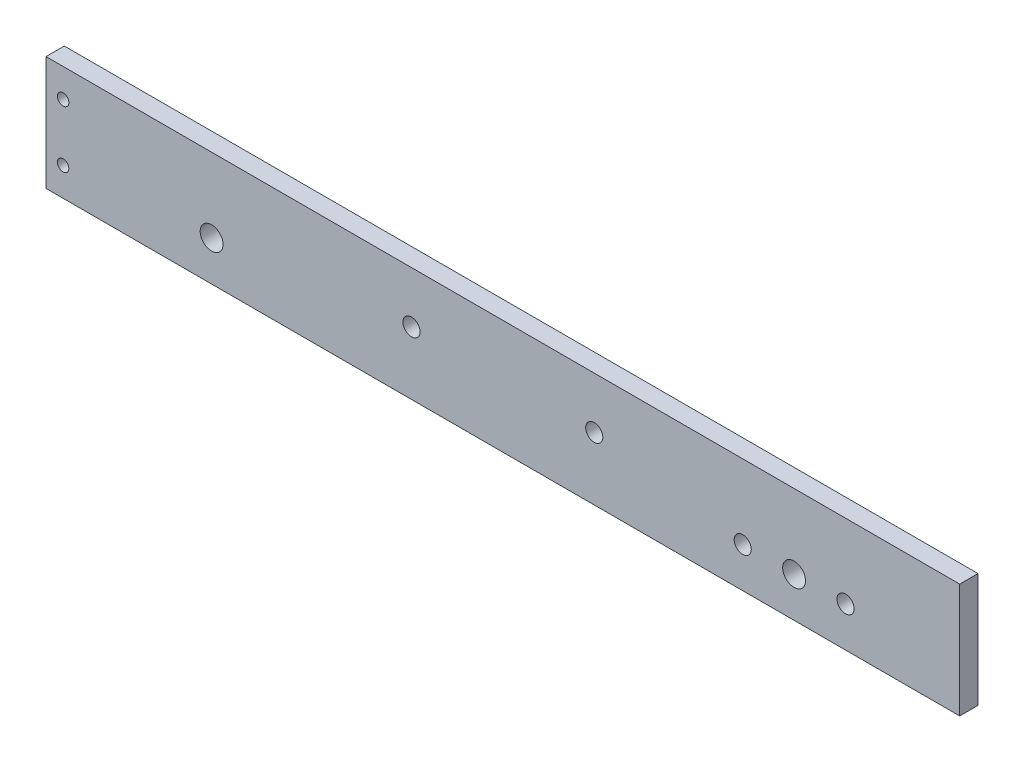
ISO-10303-21;
HEADER;
FILE_DESCRIPTION(('STEP AP214'),'2;1');
FILE_NAME('part.step','',(''),(''),'','','');
FILE_SCHEMA(('AUTOMOTIVE_DESIGN { 1 0 10303 214 1 1 1 1 }'));
ENDSEC;
DATA;
#1=APPLICATION_CONTEXT('core data for automotive mechanical design processes');
#2=APPLICATION_PROTOCOL_DEFINITION('international standard','automotive_design',2000,#1);
#3=PRODUCT_CONTEXT('',#1,'mechanical');
#4=PRODUCT('Part','Part','',(#3));
#5=PRODUCT_RELATED_PRODUCT_CATEGORY('part','',(#4));
#6=PRODUCT_DEFINITION_FORMATION('','',#4);
#7=PRODUCT_DEFINITION_CONTEXT('part definition',#1,'design');
#8=PRODUCT_DEFINITION('design','',#6,#7);
#9=PRODUCT_DEFINITION_SHAPE('','',#8);
#10=(LENGTH_UNIT() NAMED_UNIT(*) SI_UNIT(.MILLI.,.METRE.));
#11=(NAMED_UNIT(*) PLANE_ANGLE_UNIT() SI_UNIT($,.RADIAN.));
#12=(NAMED_UNIT(*) SI_UNIT($,.STERADIAN.) SOLID_ANGLE_UNIT());
#13=UNCERTAINTY_MEASURE_WITH_UNIT(LENGTH_MEASURE(1.E-05),#10,'distance_accuracy_value','');
#14=(GEOMETRIC_REPRESENTATION_CONTEXT(3) GLOBAL_UNCERTAINTY_ASSIGNED_CONTEXT((#13)) GLOBAL_UNIT_ASSIGNED_CONTEXT((#10,
#11,#12)) REPRESENTATION_CONTEXT('',''));
#15=CARTESIAN_POINT('',(0.,0.,0.));
#16=DIRECTION('',(0.,0.,1.));
#17=DIRECTION('',(1.,0.,0.));
#18=AXIS2_PLACEMENT_3D('',#15,#16,#17);
#19=CARTESIAN_POINT('',(0.,0.,6.8));
#20=DIRECTION('',(1.,0.,0.));
#21=DIRECTION('',(0.,0.,-1.));
#22=AXIS2_PLACEMENT_3D('',#19,#20,#21);
#23=PLANE('',#22);
#24=DIRECTION('',(0.,1.,0.));
#25=VECTOR('',#24,1.);
#26=CARTESIAN_POINT('',(0.,0.,10.));
#27=LINE('',#26,#25);
#28=CARTESIAN_POINT('',(0.,-20.,10.));
#29=VERTEX_POINT('',#28);
#30=CARTESIAN_POINT('',(0.,0.,10.));
#31=VERTEX_POINT('',#30);
#32=EDGE_CURVE('E103',#29,#31,#27,.T.);
#33=ORIENTED_EDGE('',*,*,#32,.T.);
#34=DIRECTION('',(0.,0.,1.));
#35=VECTOR('',#34,1.);
#36=CARTESIAN_POINT('',(0.,0.,6.8));
#37=LINE('',#36,#35);
#38=CARTESIAN_POINT('',(0.,0.,6.8));
#39=VERTEX_POINT('',#38);
#40=EDGE_CURVE('E11',#39,#31,#37,.T.);
#41=ORIENTED_EDGE('',*,*,#40,.F.);
#42=DIRECTION('',(0.,1.,0.));
#43=VECTOR('',#42,1.);
#44=CARTESIAN_POINT('',(0.,0.,6.8));
#45=LINE('',#44,#43);
#46=CARTESIAN_POINT('',(0.,-20.,6.8));
#47=VERTEX_POINT('',#46);
#48=EDGE_CURVE('E90',#47,#39,#45,.T.);
#49=ORIENTED_EDGE('',*,*,#48,.F.);
#50=DIRECTION('',(0.,0.,1.));
#51=VECTOR('',#50,1.);
#52=CARTESIAN_POINT('',(0.,-20.,6.8));
#53=LINE('',#52,#51);
#54=EDGE_CURVE('E99',#47,#29,#53,.T.);
#55=ORIENTED_EDGE('',*,*,#54,.T.);
#56=EDGE_LOOP('',(#33,#41,#49,#55));
#57=FACE_BOUND('',#56,.T.);
#58=ADVANCED_FACE('F37',(#57),#23,.F.);
#59=CARTESIAN_POINT('',(0.,0.,6.8));
#60=DIRECTION('',(0.,-1.,0.));
#61=DIRECTION('',(0.,0.,-1.));
#62=AXIS2_PLACEMENT_3D('',#59,#60,#61);
#63=PLANE('',#62);
#64=DIRECTION('',(1.,0.,0.));
#65=VECTOR('',#64,1.);
#66=CARTESIAN_POINT('',(0.,0.,10.));
#67=LINE('',#66,#65);
#68=CARTESIAN_POINT('',(160.,0.,10.));
#69=VERTEX_POINT('',#68);
#70=EDGE_CURVE('E94',#31,#69,#67,.T.);
#71=ORIENTED_EDGE('',*,*,#70,.T.);
#72=DIRECTION('',(0.,0.,1.));
#73=VECTOR('',#72,1.);
#74=CARTESIAN_POINT('',(160.,0.,6.8));
#75=LINE('',#74,#73);
#76=CARTESIAN_POINT('',(160.,0.,6.8));
#77=VERTEX_POINT('',#76);
#78=EDGE_CURVE('E46',#77,#69,#75,.T.);
#79=ORIENTED_EDGE('',*,*,#78,.F.);
#80=DIRECTION('',(1.,0.,0.));
#81=VECTOR('',#80,1.);
#82=CARTESIAN_POINT('',(0.,0.,6.8));
#83=LINE('',#82,#81);
#84=EDGE_CURVE('E85',#39,#77,#83,.T.);
#85=ORIENTED_EDGE('',*,*,#84,.F.);
#86=ORIENTED_EDGE('',*,*,#40,.T.);
#87=EDGE_LOOP('',(#71,#79,#85,#86));
#88=FACE_BOUND('',#87,.T.);
#89=ADVANCED_FACE('F93',(#88),#63,.F.);
#90=CARTESIAN_POINT('',(160.,0.,6.8));
#91=DIRECTION('',(-1.,0.,0.));
#92=DIRECTION('',(0.,0.,1.));
#93=AXIS2_PLACEMENT_3D('',#90,#91,#92);
#94=PLANE('',#93);
#95=DIRECTION('',(0.,-1.,0.));
#96=VECTOR('',#95,1.);
#97=CARTESIAN_POINT('',(160.,0.,10.));
#98=LINE('',#97,#96);
#99=CARTESIAN_POINT('',(160.,-20.,10.));
#100=VERTEX_POINT('',#99);
#101=EDGE_CURVE('E72',#69,#100,#98,.T.);
#102=ORIENTED_EDGE('',*,*,#101,.T.);
#103=DIRECTION('',(0.,0.,1.));
#104=VECTOR('',#103,1.);
#105=CARTESIAN_POINT('',(160.,-20.,6.8));
#106=LINE('',#105,#104);
#107=CARTESIAN_POINT('',(160.,-20.,6.8));
#108=VERTEX_POINT('',#107);
#109=EDGE_CURVE('E95',#108,#100,#106,.T.);
#110=ORIENTED_EDGE('',*,*,#109,.F.);
#111=DIRECTION('',(0.,-1.,0.));
#112=VECTOR('',#111,1.);
#113=CARTESIAN_POINT('',(160.,0.,6.8));
#114=LINE('',#113,#112);
#115=EDGE_CURVE('E88',#77,#108,#114,.T.);
#116=ORIENTED_EDGE('',*,*,#115,.F.);
#117=ORIENTED_EDGE('',*,*,#78,.T.);
#118=EDGE_LOOP('',(#102,#110,#116,#117));
#119=FACE_BOUND('',#118,.T.);
#120=ADVANCED_FACE('F97',(#119),#94,.F.);
#121=CARTESIAN_POINT('',(0.,-20.,6.8));
#122=DIRECTION('',(0.,1.,0.));
#123=DIRECTION('',(0.,0.,1.));
#124=AXIS2_PLACEMENT_3D('',#121,#122,#123);
#125=PLANE('',#124);
#126=DIRECTION('',(-1.,0.,0.));
#127=VECTOR('',#126,1.);
#128=CARTESIAN_POINT('',(0.,-20.,10.));
#129=LINE('',#128,#127);
#130=EDGE_CURVE('E78',#100,#29,#129,.T.);
#131=ORIENTED_EDGE('',*,*,#130,.T.);
#132=ORIENTED_EDGE('',*,*,#54,.F.);
#133=DIRECTION('',(-1.,0.,0.));
#134=VECTOR('',#133,1.);
#135=CARTESIAN_POINT('',(0.,-20.,6.8));
#136=LINE('',#135,#134);
#137=EDGE_CURVE('E55',#108,#47,#136,.T.);
#138=ORIENTED_EDGE('',*,*,#137,.F.);
#139=ORIENTED_EDGE('',*,*,#109,.T.);
#140=EDGE_LOOP('',(#131,#132,#138,#139));
#141=FACE_BOUND('',#140,.T.);
#142=ADVANCED_FACE('F177',(#141),#125,.F.);
#143=CARTESIAN_POINT('',(0.,0.,6.8));
#144=DIRECTION('',(0.,0.,1.));
#145=DIRECTION('',(1.,0.,0.));
#146=AXIS2_PLACEMENT_3D('',#143,#144,#145);
#147=PLANE('',#146);
#148=CARTESIAN_POINT('',(140.,-13.,6.8));
#149=DIRECTION('',(0.,0.,1.));
#150=DIRECTION('',(1.,0.,0.));
#151=AXIS2_PLACEMENT_3D('',#148,#149,#150);
#152=CIRCLE('',#151,1.5);
#153=CARTESIAN_POINT('',(141.5,-13.,6.8));
#154=VERTEX_POINT('',#153);
#155=EDGE_CURVE('E130',#154,#154,#152,.T.);
#156=ORIENTED_EDGE('',*,*,#155,.T.);
#157=EDGE_LOOP('',(#156));
#158=FACE_BOUND('',#157,.T.);
#159=CARTESIAN_POINT('',(122.,-13.,6.8));
#160=DIRECTION('',(0.,0.,1.));
#161=DIRECTION('',(1.,0.,0.));
#162=AXIS2_PLACEMENT_3D('',#159,#160,#161);
#163=CIRCLE('',#162,1.50000000000001);
#164=CARTESIAN_POINT('',(123.5,-13.,6.8));
#165=VERTEX_POINT('',#164);
#166=EDGE_CURVE('E289',#165,#165,#163,.T.);
#167=ORIENTED_EDGE('',*,*,#166,.T.);
#168=EDGE_LOOP('',(#167));
#169=FACE_BOUND('',#168,.T.);
#170=CARTESIAN_POINT('',(2.99999999999999,-15.,6.8));
#171=DIRECTION('',(0.,0.,1.));
#172=DIRECTION('',(1.,0.,0.));
#173=AXIS2_PLACEMENT_3D('',#170,#171,#172);
#174=CIRCLE('',#173,1.);
#175=CARTESIAN_POINT('',(3.99999999999999,-15.,6.8));
#176=VERTEX_POINT('',#175);
#177=EDGE_CURVE('E119',#176,#176,#174,.T.);
#178=ORIENTED_EDGE('',*,*,#177,.T.);
#179=EDGE_LOOP('',(#178));
#180=FACE_BOUND('',#179,.T.);
#181=CARTESIAN_POINT('',(3.,-5.,6.8));
#182=DIRECTION('',(0.,0.,1.));
#183=DIRECTION('',(1.,0.,0.));
#184=AXIS2_PLACEMENT_3D('',#181,#182,#183);
#185=CIRCLE('',#184,1.);
#186=CARTESIAN_POINT('',(4.,-5.,6.8));
#187=VERTEX_POINT('',#186);
#188=EDGE_CURVE('E125',#187,#187,#185,.T.);
#189=ORIENTED_EDGE('',*,*,#188,.T.);
#190=EDGE_LOOP('',(#189));
#191=FACE_BOUND('',#190,.T.);
#192=CARTESIAN_POINT('',(63.9999999999999,-9.,6.8));
#193=DIRECTION('',(0.,0.,1.));
#194=DIRECTION('',(1.,0.,0.));
#195=AXIS2_PLACEMENT_3D('',#192,#193,#194);
#196=CIRCLE('',#195,1.5);
#197=CARTESIAN_POINT('',(65.4999999999999,-9.,6.8));
#198=VERTEX_POINT('',#197);
#199=EDGE_CURVE('E143',#198,#198,#196,.T.);
#200=ORIENTED_EDGE('',*,*,#199,.T.);
#201=EDGE_LOOP('',(#200));
#202=FACE_BOUND('',#201,.T.);
#203=CARTESIAN_POINT('',(95.9999999999999,-9.,6.8));
#204=DIRECTION('',(0.,0.,1.));
#205=DIRECTION('',(1.,0.,0.));
#206=AXIS2_PLACEMENT_3D('',#203,#204,#205);
#207=CIRCLE('',#206,1.5);
#208=CARTESIAN_POINT('',(97.4999999999999,-9.,6.8));
#209=VERTEX_POINT('',#208);
#210=EDGE_CURVE('E138',#209,#209,#207,.T.);
#211=ORIENTED_EDGE('',*,*,#210,.T.);
#212=EDGE_LOOP('',(#211));
#213=FACE_BOUND('',#212,.T.);
#214=CARTESIAN_POINT('',(131.,-13.,6.8));
#215=DIRECTION('',(0.,0.,1.));
#216=DIRECTION('',(1.,0.,0.));
#217=AXIS2_PLACEMENT_3D('',#214,#215,#216);
#218=CIRCLE('',#217,2.);
#219=CARTESIAN_POINT('',(133.,-13.,6.8));
#220=VERTEX_POINT('',#219);
#221=EDGE_CURVE('E115',#220,#220,#218,.T.);
#222=ORIENTED_EDGE('',*,*,#221,.T.);
#223=EDGE_LOOP('',(#222));
#224=FACE_BOUND('',#223,.T.);
#225=CARTESIAN_POINT('',(29.,-13.,6.8));
#226=DIRECTION('',(0.,0.,1.));
#227=DIRECTION('',(1.,0.,0.));
#228=AXIS2_PLACEMENT_3D('',#225,#226,#227);
#229=CIRCLE('',#228,2.);
#230=CARTESIAN_POINT('',(31.,-13.,6.8));
#231=VERTEX_POINT('',#230);
#232=EDGE_CURVE('E146',#231,#231,#229,.T.);
#233=ORIENTED_EDGE('',*,*,#232,.T.);
#234=EDGE_LOOP('',(#233));
#235=FACE_BOUND('',#234,.T.);
#236=ORIENTED_EDGE('',*,*,#48,.T.);
#237=ORIENTED_EDGE('',*,*,#84,.T.);
#238=ORIENTED_EDGE('',*,*,#115,.T.);
#239=ORIENTED_EDGE('',*,*,#137,.T.);
#240=EDGE_LOOP('',(#236,#237,#238,#239));
#241=FACE_BOUND('',#240,.T.);
#242=ADVANCED_FACE('F86',(#158,#169,#180,#191,#202,#213,#224,#235,#241),#147,.F.);
#243=CARTESIAN_POINT('',(0.,0.,10.));
#244=DIRECTION('',(0.,0.,1.));
#245=DIRECTION('',(1.,0.,0.));
#246=AXIS2_PLACEMENT_3D('',#243,#244,#245);
#247=PLANE('',#246);
#248=CARTESIAN_POINT('',(140.,-13.,10.));
#249=DIRECTION('',(0.,0.,1.));
#250=DIRECTION('',(1.,0.,0.));
#251=AXIS2_PLACEMENT_3D('',#248,#249,#250);
#252=CIRCLE('',#251,1.5);
#253=CARTESIAN_POINT('',(141.5,-13.,10.));
#254=VERTEX_POINT('',#253);
#255=EDGE_CURVE('E286',#254,#254,#252,.T.);
#256=ORIENTED_EDGE('',*,*,#255,.F.);
#257=EDGE_LOOP('',(#256));
#258=FACE_BOUND('',#257,.T.);
#259=CARTESIAN_POINT('',(122.,-13.,10.));
#260=DIRECTION('',(0.,0.,1.));
#261=DIRECTION('',(1.,0.,0.));
#262=AXIS2_PLACEMENT_3D('',#259,#260,#261);
#263=CIRCLE('',#262,1.50000000000001);
#264=CARTESIAN_POINT('',(123.5,-13.,10.));
#265=VERTEX_POINT('',#264);
#266=EDGE_CURVE('E293',#265,#265,#263,.T.);
#267=ORIENTED_EDGE('',*,*,#266,.F.);
#268=EDGE_LOOP('',(#267));
#269=FACE_BOUND('',#268,.T.);
#270=CARTESIAN_POINT('',(2.99999999999999,-15.,10.));
#271=DIRECTION('',(0.,0.,1.));
#272=DIRECTION('',(1.,0.,0.));
#273=AXIS2_PLACEMENT_3D('',#270,#271,#272);
#274=CIRCLE('',#273,1.);
#275=CARTESIAN_POINT('',(3.99999999999999,-15.,10.));
#276=VERTEX_POINT('',#275);
#277=EDGE_CURVE('E40',#276,#276,#274,.T.);
#278=ORIENTED_EDGE('',*,*,#277,.F.);
#279=EDGE_LOOP('',(#278));
#280=FACE_BOUND('',#279,.T.);
#281=CARTESIAN_POINT('',(3.,-5.,10.));
#282=DIRECTION('',(0.,0.,1.));
#283=DIRECTION('',(1.,0.,0.));
#284=AXIS2_PLACEMENT_3D('',#281,#282,#283);
#285=CIRCLE('',#284,1.);
#286=CARTESIAN_POINT('',(4.,-5.,10.));
#287=VERTEX_POINT('',#286);
#288=EDGE_CURVE('E117',#287,#287,#285,.T.);
#289=ORIENTED_EDGE('',*,*,#288,.F.);
#290=EDGE_LOOP('',(#289));
#291=FACE_BOUND('',#290,.T.);
#292=CARTESIAN_POINT('',(63.9999999999999,-9.,10.));
#293=DIRECTION('',(0.,0.,1.));
#294=DIRECTION('',(1.,0.,0.));
#295=AXIS2_PLACEMENT_3D('',#292,#293,#294);
#296=CIRCLE('',#295,1.5);
#297=CARTESIAN_POINT('',(65.4999999999999,-9.,10.));
#298=VERTEX_POINT('',#297);
#299=EDGE_CURVE('E135',#298,#298,#296,.T.);
#300=ORIENTED_EDGE('',*,*,#299,.F.);
#301=EDGE_LOOP('',(#300));
#302=FACE_BOUND('',#301,.T.);
#303=CARTESIAN_POINT('',(95.9999999999999,-9.,10.));
#304=DIRECTION('',(0.,0.,1.));
#305=DIRECTION('',(1.,0.,0.));
#306=AXIS2_PLACEMENT_3D('',#303,#304,#305);
#307=CIRCLE('',#306,1.5);
#308=CARTESIAN_POINT('',(97.4999999999999,-9.,10.));
#309=VERTEX_POINT('',#308);
#310=EDGE_CURVE('E123',#309,#309,#307,.T.);
#311=ORIENTED_EDGE('',*,*,#310,.F.);
#312=EDGE_LOOP('',(#311));
#313=FACE_BOUND('',#312,.T.);
#314=CARTESIAN_POINT('',(131.,-13.,10.));
#315=DIRECTION('',(0.,0.,1.));
#316=DIRECTION('',(1.,0.,0.));
#317=AXIS2_PLACEMENT_3D('',#314,#315,#316);
#318=CIRCLE('',#317,2.);
#319=CARTESIAN_POINT('',(133.,-13.,10.));
#320=VERTEX_POINT('',#319);
#321=EDGE_CURVE('E106',#320,#320,#318,.T.);
#322=ORIENTED_EDGE('',*,*,#321,.F.);
#323=EDGE_LOOP('',(#322));
#324=FACE_BOUND('',#323,.T.);
#325=CARTESIAN_POINT('',(29.,-13.,10.));
#326=DIRECTION('',(0.,0.,1.));
#327=DIRECTION('',(1.,0.,0.));
#328=AXIS2_PLACEMENT_3D('',#325,#326,#327);
#329=CIRCLE('',#328,2.);
#330=CARTESIAN_POINT('',(31.,-13.,10.));
#331=VERTEX_POINT('',#330);
#332=EDGE_CURVE('E112',#331,#331,#329,.T.);
#333=ORIENTED_EDGE('',*,*,#332,.F.);
#334=EDGE_LOOP('',(#333));
#335=FACE_BOUND('',#334,.T.);
#336=ORIENTED_EDGE('',*,*,#32,.F.);
#337=ORIENTED_EDGE('',*,*,#130,.F.);
#338=ORIENTED_EDGE('',*,*,#101,.F.);
#339=ORIENTED_EDGE('',*,*,#70,.F.);
#340=EDGE_LOOP('',(#336,#337,#338,#339));
#341=FACE_BOUND('',#340,.T.);
#342=ADVANCED_FACE('F156',(#258,#269,#280,#291,#302,#313,#324,#335,#341),#247,.T.);
#343=CARTESIAN_POINT('',(29.,-13.,6.8));
#344=DIRECTION('',(0.,0.,1.));
#345=DIRECTION('',(1.,0.,0.));
#346=AXIS2_PLACEMENT_3D('',#343,#344,#345);
#347=CYLINDRICAL_SURFACE('',#346,2.);
#348=CARTESIAN_POINT('',(31.,-13.,10.));
#349=CARTESIAN_POINT('',(31.,-13.,9.96666666666667));
#350=CARTESIAN_POINT('',(31.,-13.,9.93333333333333));
#351=CARTESIAN_POINT('',(31.,-13.,9.86666666666667));
#352=CARTESIAN_POINT('',(31.,-13.,9.83333333333333));
#353=CARTESIAN_POINT('',(31.,-13.,9.76666666666667));
#354=CARTESIAN_POINT('',(31.,-13.,9.73333333333333));
#355=CARTESIAN_POINT('',(31.,-13.,9.66666666666667));
#356=CARTESIAN_POINT('',(31.,-13.,9.63333333333333));
#357=CARTESIAN_POINT('',(31.,-13.,9.56666666666667));
#358=CARTESIAN_POINT('',(31.,-13.,9.53333333333333));
#359=CARTESIAN_POINT('',(31.,-13.,9.46666666666667));
#360=CARTESIAN_POINT('',(31.,-13.,9.43333333333333));
#361=CARTESIAN_POINT('',(31.,-13.,9.36666666666667));
#362=CARTESIAN_POINT('',(31.,-13.,9.33333333333333));
#363=CARTESIAN_POINT('',(31.,-13.,9.26666666666667));
#364=CARTESIAN_POINT('',(31.,-13.,9.23333333333333));
#365=CARTESIAN_POINT('',(31.,-13.,9.16666666666667));
#366=CARTESIAN_POINT('',(31.,-13.,9.13333333333333));
#367=CARTESIAN_POINT('',(31.,-13.,9.06666666666667));
#368=CARTESIAN_POINT('',(31.,-13.,9.03333333333333));
#369=CARTESIAN_POINT('',(31.,-13.,8.96666666666667));
#370=CARTESIAN_POINT('',(31.,-13.,8.93333333333333));
#371=CARTESIAN_POINT('',(31.,-13.,8.86666666666667));
#372=CARTESIAN_POINT('',(31.,-13.,8.83333333333333));
#373=CARTESIAN_POINT('',(31.,-13.,8.76666666666667));
#374=CARTESIAN_POINT('',(31.,-13.,8.73333333333333));
#375=CARTESIAN_POINT('',(31.,-13.,8.66666666666667));
#376=CARTESIAN_POINT('',(31.,-13.,8.63333333333333));
#377=CARTESIAN_POINT('',(31.,-13.,8.56666666666667));
#378=CARTESIAN_POINT('',(31.,-13.,8.53333333333333));
#379=CARTESIAN_POINT('',(31.,-13.,8.46666666666667));
#380=CARTESIAN_POINT('',(31.,-13.,8.43333333333333));
#381=CARTESIAN_POINT('',(31.,-13.,8.36666666666667));
#382=CARTESIAN_POINT('',(31.,-13.,8.33333333333333));
#383=CARTESIAN_POINT('',(31.,-13.,8.26666666666667));
#384=CARTESIAN_POINT('',(31.,-13.,8.23333333333333));
#385=CARTESIAN_POINT('',(31.,-13.,8.16666666666667));
#386=CARTESIAN_POINT('',(31.,-13.,8.13333333333333));
#387=CARTESIAN_POINT('',(31.,-13.,8.06666666666667));
#388=CARTESIAN_POINT('',(31.,-13.,8.03333333333333));
#389=CARTESIAN_POINT('',(31.,-13.,7.96666666666667));
#390=CARTESIAN_POINT('',(31.,-13.,7.93333333333333));
#391=CARTESIAN_POINT('',(31.,-13.,7.86666666666667));
#392=CARTESIAN_POINT('',(31.,-13.,7.83333333333333));
#393=CARTESIAN_POINT('',(31.,-13.,7.76666666666667));
#394=CARTESIAN_POINT('',(31.,-13.,7.73333333333333));
#395=CARTESIAN_POINT('',(31.,-13.,7.66666666666667));
#396=CARTESIAN_POINT('',(31.,-13.,7.63333333333333));
#397=CARTESIAN_POINT('',(31.,-13.,7.56666666666667));
#398=CARTESIAN_POINT('',(31.,-13.,7.53333333333333));
#399=CARTESIAN_POINT('',(31.,-13.,7.46666666666667));
#400=CARTESIAN_POINT('',(31.,-13.,7.43333333333333));
#401=CARTESIAN_POINT('',(31.,-13.,7.36666666666667));
#402=CARTESIAN_POINT('',(31.,-13.,7.33333333333333));
#403=CARTESIAN_POINT('',(31.,-13.,7.26666666666667));
#404=CARTESIAN_POINT('',(31.,-13.,7.23333333333333));
#405=CARTESIAN_POINT('',(31.,-13.,7.16666666666667));
#406=CARTESIAN_POINT('',(31.,-13.,7.13333333333333));
#407=CARTESIAN_POINT('',(31.,-13.,7.06666666666667));
#408=CARTESIAN_POINT('',(31.,-13.,7.03333333333333));
#409=CARTESIAN_POINT('',(31.,-13.,6.96666666666667));
#410=CARTESIAN_POINT('',(31.,-13.,6.93333333333333));
#411=CARTESIAN_POINT('',(31.,-13.,6.86666666666667));
#412=CARTESIAN_POINT('',(31.,-13.,6.83333333333333));
#413=CARTESIAN_POINT('',(31.,-13.,6.8));
#414=B_SPLINE_CURVE_WITH_KNOTS('',3,(#348,#349,#350,#351,#352,#353,#354,#355,#356,#357,#358,
#359,#360,#361,#362,#363,#364,#365,#366,#367,#368,#369,#370,#371,#372,#373,#374,#375,#376,#377,
#378,#379,#380,#381,#382,#383,#384,#385,#386,#387,#388,#389,#390,#391,#392,#393,#394,#395,#396,
#397,#398,#399,#400,#401,#402,#403,#404,#405,#406,#407,#408,#409,#410,#411,#412,#413),
.UNSPECIFIED.,.F.,.F.,(4,2,2,2,2,2,2,2,2,2,2,2,2,2,2,2,2,2,2,2,2,2,2,2,2,2,2,2,2,2,2,2,4),(0.,
0.100000000000001,0.200000000000001,0.3,0.400000000000001,0.5,0.6,0.700000000000001,0.8,0.9,1.,
1.1,1.2,1.3,1.4,1.5,1.6,1.7,1.8,1.9,2.,2.1,2.2,2.3,2.4,2.5,2.6,2.7,2.8,2.9,3.,3.1,3.2),.UNSPECIFIED.);
#415=EDGE_CURVE('BSEAM153',#331,#231,#414,.T.);
#416=ORIENTED_EDGE('',*,*,#332,.T.);
#417=ORIENTED_EDGE('',*,*,#232,.F.);
#418=ORIENTED_EDGE('',*,*,#415,.T.);
#419=ORIENTED_EDGE('',*,*,#415,.F.);
#420=EDGE_LOOP('',(#416,#418,#417,#419));
#421=FACE_BOUND('',#420,.T.);
#422=ADVANCED_FACE('F153',(#421),#347,.F.);
#423=CARTESIAN_POINT('',(131.,-13.,6.8));
#424=DIRECTION('',(0.,0.,1.));
#425=DIRECTION('',(1.,0.,0.));
#426=AXIS2_PLACEMENT_3D('',#423,#424,#425);
#427=CYLINDRICAL_SURFACE('',#426,2.);
#428=CARTESIAN_POINT('',(133.,-13.,10.));
#429=CARTESIAN_POINT('',(133.,-13.,9.96666666666667));
#430=CARTESIAN_POINT('',(133.,-13.,9.93333333333333));
#431=CARTESIAN_POINT('',(133.,-13.,9.86666666666667));
#432=CARTESIAN_POINT('',(133.,-13.,9.83333333333333));
#433=CARTESIAN_POINT('',(133.,-13.,9.76666666666667));
#434=CARTESIAN_POINT('',(133.,-13.,9.73333333333333));
#435=CARTESIAN_POINT('',(133.,-13.,9.66666666666667));
#436=CARTESIAN_POINT('',(133.,-13.,9.63333333333333));
#437=CARTESIAN_POINT('',(133.,-13.,9.56666666666667));
#438=CARTESIAN_POINT('',(133.,-13.,9.53333333333333));
#439=CARTESIAN_POINT('',(133.,-13.,9.46666666666667));
#440=CARTESIAN_POINT('',(133.,-13.,9.43333333333333));
#441=CARTESIAN_POINT('',(133.,-13.,9.36666666666667));
#442=CARTESIAN_POINT('',(133.,-13.,9.33333333333333));
#443=CARTESIAN_POINT('',(133.,-13.,9.26666666666667));
#444=CARTESIAN_POINT('',(133.,-13.,9.23333333333333));
#445=CARTESIAN_POINT('',(133.,-13.,9.16666666666667));
#446=CARTESIAN_POINT('',(133.,-13.,9.13333333333333));
#447=CARTESIAN_POINT('',(133.,-13.,9.06666666666667));
#448=CARTESIAN_POINT('',(133.,-13.,9.03333333333333));
#449=CARTESIAN_POINT('',(133.,-13.,8.96666666666667));
#450=CARTESIAN_POINT('',(133.,-13.,8.93333333333333));
#451=CARTESIAN_POINT('',(133.,-13.,8.86666666666667));
#452=CARTESIAN_POINT('',(133.,-13.,8.83333333333333));
#453=CARTESIAN_POINT('',(133.,-13.,8.76666666666667));
#454=CARTESIAN_POINT('',(133.,-13.,8.73333333333333));
#455=CARTESIAN_POINT('',(133.,-13.,8.66666666666667));
#456=CARTESIAN_POINT('',(133.,-13.,8.63333333333333));
#457=CARTESIAN_POINT('',(133.,-13.,8.56666666666667));
#458=CARTESIAN_POINT('',(133.,-13.,8.53333333333333));
#459=CARTESIAN_POINT('',(133.,-13.,8.46666666666667));
#460=CARTESIAN_POINT('',(133.,-13.,8.43333333333333));
#461=CARTESIAN_POINT('',(133.,-13.,8.36666666666667));
#462=CARTESIAN_POINT('',(133.,-13.,8.33333333333333));
#463=CARTESIAN_POINT('',(133.,-13.,8.26666666666667));
#464=CARTESIAN_POINT('',(133.,-13.,8.23333333333333));
#465=CARTESIAN_POINT('',(133.,-13.,8.16666666666667));
#466=CARTESIAN_POINT('',(133.,-13.,8.13333333333333));
#467=CARTESIAN_POINT('',(133.,-13.,8.06666666666667));
#468=CARTESIAN_POINT('',(133.,-13.,8.03333333333333));
#469=CARTESIAN_POINT('',(133.,-13.,7.96666666666667));
#470=CARTESIAN_POINT('',(133.,-13.,7.93333333333333));
#471=CARTESIAN_POINT('',(133.,-13.,7.86666666666667));
#472=CARTESIAN_POINT('',(133.,-13.,7.83333333333333));
#473=CARTESIAN_POINT('',(133.,-13.,7.76666666666667));
#474=CARTESIAN_POINT('',(133.,-13.,7.73333333333333));
#475=CARTESIAN_POINT('',(133.,-13.,7.66666666666667));
#476=CARTESIAN_POINT('',(133.,-13.,7.63333333333333));
#477=CARTESIAN_POINT('',(133.,-13.,7.56666666666667));
#478=CARTESIAN_POINT('',(133.,-13.,7.53333333333333));
#479=CARTESIAN_POINT('',(133.,-13.,7.46666666666667));
#480=CARTESIAN_POINT('',(133.,-13.,7.43333333333333));
#481=CARTESIAN_POINT('',(133.,-13.,7.36666666666667));
#482=CARTESIAN_POINT('',(133.,-13.,7.33333333333333));
#483=CARTESIAN_POINT('',(133.,-13.,7.26666666666667));
#484=CARTESIAN_POINT('',(133.,-13.,7.23333333333333));
#485=CARTESIAN_POINT('',(133.,-13.,7.16666666666667));
#486=CARTESIAN_POINT('',(133.,-13.,7.13333333333333));
#487=CARTESIAN_POINT('',(133.,-13.,7.06666666666667));
#488=CARTESIAN_POINT('',(133.,-13.,7.03333333333333));
#489=CARTESIAN_POINT('',(133.,-13.,6.96666666666667));
#490=CARTESIAN_POINT('',(133.,-13.,6.93333333333333));
#491=CARTESIAN_POINT('',(133.,-13.,6.86666666666667));
#492=CARTESIAN_POINT('',(133.,-13.,6.83333333333333));
#493=CARTESIAN_POINT('',(133.,-13.,6.8));
#494=B_SPLINE_CURVE_WITH_KNOTS('',3,(#428,#429,#430,#431,#432,#433,#434,#435,#436,#437,#438,
#439,#440,#441,#442,#443,#444,#445,#446,#447,#448,#449,#450,#451,#452,#453,#454,#455,#456,#457,
#458,#459,#460,#461,#462,#463,#464,#465,#466,#467,#468,#469,#470,#471,#472,#473,#474,#475,#476,
#477,#478,#479,#480,#481,#482,#483,#484,#485,#486,#487,#488,#489,#490,#491,#492,#493),
.UNSPECIFIED.,.F.,.F.,(4,2,2,2,2,2,2,2,2,2,2,2,2,2,2,2,2,2,2,2,2,2,2,2,2,2,2,2,2,2,2,2,4),(0.,
0.100000000000001,0.200000000000001,0.3,0.400000000000001,0.5,0.6,0.700000000000001,0.8,0.9,1.,
1.1,1.2,1.3,1.4,1.5,1.6,1.7,1.8,1.9,2.,2.1,2.2,2.3,2.4,2.5,2.6,2.7,2.8,2.9,3.,3.1,3.2),.UNSPECIFIED.);
#495=EDGE_CURVE('BSEAM155',#320,#220,#494,.T.);
#496=ORIENTED_EDGE('',*,*,#321,.T.);
#497=ORIENTED_EDGE('',*,*,#221,.F.);
#498=ORIENTED_EDGE('',*,*,#495,.T.);
#499=ORIENTED_EDGE('',*,*,#495,.F.);
#500=EDGE_LOOP('',(#496,#498,#497,#499));
#501=FACE_BOUND('',#500,.T.);
#502=ADVANCED_FACE('F155',(#501),#427,.F.);
#503=CARTESIAN_POINT('',(95.9999999999999,-9.,0.));
#504=DIRECTION('',(0.,0.,1.));
#505=DIRECTION('',(1.,0.,0.));
#506=AXIS2_PLACEMENT_3D('',#503,#504,#505);
#507=CYLINDRICAL_SURFACE('',#506,1.5);
#508=ORIENTED_EDGE('',*,*,#310,.T.);
#509=EDGE_LOOP('',(#508));
#510=FACE_BOUND('',#509,.T.);
#511=ORIENTED_EDGE('',*,*,#210,.F.);
#512=EDGE_LOOP('',(#511));
#513=FACE_BOUND('',#512,.T.);
#514=ADVANCED_FACE('F163',(#510,#513),#507,.F.);
#515=CARTESIAN_POINT('',(63.9999999999999,-9.,0.));
#516=DIRECTION('',(0.,0.,1.));
#517=DIRECTION('',(1.,0.,0.));
#518=AXIS2_PLACEMENT_3D('',#515,#516,#517);
#519=CYLINDRICAL_SURFACE('',#518,1.5);
#520=ORIENTED_EDGE('',*,*,#299,.T.);
#521=EDGE_LOOP('',(#520));
#522=FACE_BOUND('',#521,.T.);
#523=ORIENTED_EDGE('',*,*,#199,.F.);
#524=EDGE_LOOP('',(#523));
#525=FACE_BOUND('',#524,.T.);
#526=ADVANCED_FACE('F230',(#522,#525),#519,.F.);
#527=CARTESIAN_POINT('',(3.,-5.,6.8));
#528=DIRECTION('',(0.,0.,1.));
#529=DIRECTION('',(1.,0.,0.));
#530=AXIS2_PLACEMENT_3D('',#527,#528,#529);
#531=CYLINDRICAL_SURFACE('',#530,1.);
#532=CARTESIAN_POINT('',(4.,-5.,10.));
#533=CARTESIAN_POINT('',(4.,-5.,9.96666666666667));
#534=CARTESIAN_POINT('',(4.,-5.,9.93333333333333));
#535=CARTESIAN_POINT('',(4.,-5.,9.86666666666667));
#536=CARTESIAN_POINT('',(4.,-5.,9.83333333333333));
#537=CARTESIAN_POINT('',(4.,-5.,9.76666666666667));
#538=CARTESIAN_POINT('',(4.,-5.,9.73333333333333));
#539=CARTESIAN_POINT('',(4.,-5.,9.66666666666667));
#540=CARTESIAN_POINT('',(4.,-5.,9.63333333333333));
#541=CARTESIAN_POINT('',(4.,-5.,9.56666666666667));
#542=CARTESIAN_POINT('',(4.,-5.,9.53333333333333));
#543=CARTESIAN_POINT('',(4.,-5.,9.46666666666667));
#544=CARTESIAN_POINT('',(4.,-5.,9.43333333333333));
#545=CARTESIAN_POINT('',(4.,-5.,9.36666666666667));
#546=CARTESIAN_POINT('',(4.,-5.,9.33333333333333));
#547=CARTESIAN_POINT('',(4.,-5.,9.26666666666667));
#548=CARTESIAN_POINT('',(4.,-5.,9.23333333333333));
#549=CARTESIAN_POINT('',(4.,-5.,9.16666666666667));
#550=CARTESIAN_POINT('',(4.,-5.,9.13333333333333));
#551=CARTESIAN_POINT('',(4.,-5.,9.06666666666667));
#552=CARTESIAN_POINT('',(4.,-5.,9.03333333333333));
#553=CARTESIAN_POINT('',(4.,-5.,8.96666666666667));
#554=CARTESIAN_POINT('',(4.,-5.,8.93333333333333));
#555=CARTESIAN_POINT('',(4.,-5.,8.86666666666667));
#556=CARTESIAN_POINT('',(4.,-5.,8.83333333333333));
#557=CARTESIAN_POINT('',(4.,-5.,8.76666666666667));
#558=CARTESIAN_POINT('',(4.,-5.,8.73333333333333));
#559=CARTESIAN_POINT('',(4.,-5.,8.66666666666667));
#560=CARTESIAN_POINT('',(4.,-5.,8.63333333333333));
#561=CARTESIAN_POINT('',(4.,-5.,8.56666666666667));
#562=CARTESIAN_POINT('',(4.,-5.,8.53333333333333));
#563=CARTESIAN_POINT('',(4.,-5.,8.46666666666667));
#564=CARTESIAN_POINT('',(4.,-5.,8.43333333333333));
#565=CARTESIAN_POINT('',(4.,-5.,8.36666666666667));
#566=CARTESIAN_POINT('',(4.,-5.,8.33333333333333));
#567=CARTESIAN_POINT('',(4.,-5.,8.26666666666667));
#568=CARTESIAN_POINT('',(4.,-5.,8.23333333333333));
#569=CARTESIAN_POINT('',(4.,-5.,8.16666666666667));
#570=CARTESIAN_POINT('',(4.,-5.,8.13333333333333));
#571=CARTESIAN_POINT('',(4.,-5.,8.06666666666667));
#572=CARTESIAN_POINT('',(4.,-5.,8.03333333333333));
#573=CARTESIAN_POINT('',(4.,-5.,7.96666666666667));
#574=CARTESIAN_POINT('',(4.,-5.,7.93333333333333));
#575=CARTESIAN_POINT('',(4.,-5.,7.86666666666667));
#576=CARTESIAN_POINT('',(4.,-5.,7.83333333333333));
#577=CARTESIAN_POINT('',(4.,-5.,7.76666666666667));
#578=CARTESIAN_POINT('',(4.,-5.,7.73333333333333));
#579=CARTESIAN_POINT('',(4.,-5.,7.66666666666667));
#580=CARTESIAN_POINT('',(4.,-5.,7.63333333333333));
#581=CARTESIAN_POINT('',(4.,-5.,7.56666666666667));
#582=CARTESIAN_POINT('',(4.,-5.,7.53333333333333));
#583=CARTESIAN_POINT('',(4.,-5.,7.46666666666667));
#584=CARTESIAN_POINT('',(4.,-5.,7.43333333333333));
#585=CARTESIAN_POINT('',(4.,-5.,7.36666666666667));
#586=CARTESIAN_POINT('',(4.,-5.,7.33333333333333));
#587=CARTESIAN_POINT('',(4.,-5.,7.26666666666667));
#588=CARTESIAN_POINT('',(4.,-5.,7.23333333333333));
#589=CARTESIAN_POINT('',(4.,-5.,7.16666666666667));
#590=CARTESIAN_POINT('',(4.,-5.,7.13333333333333));
#591=CARTESIAN_POINT('',(4.,-5.,7.06666666666667));
#592=CARTESIAN_POINT('',(4.,-5.,7.03333333333333));
#593=CARTESIAN_POINT('',(4.,-5.,6.96666666666667));
#594=CARTESIAN_POINT('',(4.,-5.,6.93333333333333));
#595=CARTESIAN_POINT('',(4.,-5.,6.86666666666667));
#596=CARTESIAN_POINT('',(4.,-5.,6.83333333333333));
#597=CARTESIAN_POINT('',(4.,-5.,6.8));
#598=B_SPLINE_CURVE_WITH_KNOTS('',3,(#532,#533,#534,#535,#536,#537,#538,#539,#540,#541,#542,
#543,#544,#545,#546,#547,#548,#549,#550,#551,#552,#553,#554,#555,#556,#557,#558,#559,#560,#561,
#562,#563,#564,#565,#566,#567,#568,#569,#570,#571,#572,#573,#574,#575,#576,#577,#578,#579,#580,
#581,#582,#583,#584,#585,#586,#587,#588,#589,#590,#591,#592,#593,#594,#595,#596,#597),
.UNSPECIFIED.,.F.,.F.,(4,2,2,2,2,2,2,2,2,2,2,2,2,2,2,2,2,2,2,2,2,2,2,2,2,2,2,2,2,2,2,2,4),(0.,
0.100000000000001,0.200000000000001,0.3,0.400000000000001,0.5,0.6,0.700000000000001,0.8,0.9,1.,
1.1,1.2,1.3,1.4,1.5,1.6,1.7,1.8,1.9,2.,2.1,2.2,2.3,2.4,2.5,2.6,2.7,2.8,2.9,3.,3.1,3.2),.UNSPECIFIED.);
#599=EDGE_CURVE('BSEAM239',#287,#187,#598,.T.);
#600=ORIENTED_EDGE('',*,*,#288,.T.);
#601=ORIENTED_EDGE('',*,*,#188,.F.);
#602=ORIENTED_EDGE('',*,*,#599,.T.);
#603=ORIENTED_EDGE('',*,*,#599,.F.);
#604=EDGE_LOOP('',(#600,#602,#601,#603));
#605=FACE_BOUND('',#604,.T.);
#606=ADVANCED_FACE('F239',(#605),#531,.F.);
#607=CARTESIAN_POINT('',(2.99999999999999,-15.,6.8));
#608=DIRECTION('',(0.,0.,1.));
#609=DIRECTION('',(1.,0.,0.));
#610=AXIS2_PLACEMENT_3D('',#607,#608,#609);
#611=CYLINDRICAL_SURFACE('',#610,1.);
#612=CARTESIAN_POINT('',(3.99999999999999,-15.,10.));
#613=CARTESIAN_POINT('',(3.99999999999999,-15.,9.96666666666667));
#614=CARTESIAN_POINT('',(3.99999999999999,-15.,9.93333333333333));
#615=CARTESIAN_POINT('',(3.99999999999999,-15.,9.86666666666667));
#616=CARTESIAN_POINT('',(3.99999999999999,-15.,9.83333333333333));
#617=CARTESIAN_POINT('',(3.99999999999999,-15.,9.76666666666667));
#618=CARTESIAN_POINT('',(3.99999999999999,-15.,9.73333333333333));
#619=CARTESIAN_POINT('',(3.99999999999999,-15.,9.66666666666667));
#620=CARTESIAN_POINT('',(3.99999999999999,-15.,9.63333333333333));
#621=CARTESIAN_POINT('',(3.99999999999999,-15.,9.56666666666667));
#622=CARTESIAN_POINT('',(3.99999999999999,-15.,9.53333333333333));
#623=CARTESIAN_POINT('',(3.99999999999999,-15.,9.46666666666667));
#624=CARTESIAN_POINT('',(3.99999999999999,-15.,9.43333333333333));
#625=CARTESIAN_POINT('',(3.99999999999999,-15.,9.36666666666667));
#626=CARTESIAN_POINT('',(3.99999999999999,-15.,9.33333333333333));
#627=CARTESIAN_POINT('',(3.99999999999999,-15.,9.26666666666667));
#628=CARTESIAN_POINT('',(3.99999999999999,-15.,9.23333333333333));
#629=CARTESIAN_POINT('',(3.99999999999999,-15.,9.16666666666667));
#630=CARTESIAN_POINT('',(3.99999999999999,-15.,9.13333333333333));
#631=CARTESIAN_POINT('',(3.99999999999999,-15.,9.06666666666667));
#632=CARTESIAN_POINT('',(3.99999999999999,-15.,9.03333333333333));
#633=CARTESIAN_POINT('',(3.99999999999999,-15.,8.96666666666667));
#634=CARTESIAN_POINT('',(3.99999999999999,-15.,8.93333333333333));
#635=CARTESIAN_POINT('',(3.99999999999999,-15.,8.86666666666667));
#636=CARTESIAN_POINT('',(3.99999999999999,-15.,8.83333333333333));
#637=CARTESIAN_POINT('',(3.99999999999999,-15.,8.76666666666667));
#638=CARTESIAN_POINT('',(3.99999999999999,-15.,8.73333333333333));
#639=CARTESIAN_POINT('',(3.99999999999999,-15.,8.66666666666667));
#640=CARTESIAN_POINT('',(3.99999999999999,-15.,8.63333333333333));
#641=CARTESIAN_POINT('',(3.99999999999999,-15.,8.56666666666667));
#642=CARTESIAN_POINT('',(3.99999999999999,-15.,8.53333333333333));
#643=CARTESIAN_POINT('',(3.99999999999999,-15.,8.46666666666667));
#644=CARTESIAN_POINT('',(3.99999999999999,-15.,8.43333333333333));
#645=CARTESIAN_POINT('',(3.99999999999999,-15.,8.36666666666667));
#646=CARTESIAN_POINT('',(3.99999999999999,-15.,8.33333333333333));
#647=CARTESIAN_POINT('',(3.99999999999999,-15.,8.26666666666667));
#648=CARTESIAN_POINT('',(3.99999999999999,-15.,8.23333333333333));
#649=CARTESIAN_POINT('',(3.99999999999999,-15.,8.16666666666667));
#650=CARTESIAN_POINT('',(3.99999999999999,-15.,8.13333333333333));
#651=CARTESIAN_POINT('',(3.99999999999999,-15.,8.06666666666667));
#652=CARTESIAN_POINT('',(3.99999999999999,-15.,8.03333333333333));
#653=CARTESIAN_POINT('',(3.99999999999999,-15.,7.96666666666667));
#654=CARTESIAN_POINT('',(3.99999999999999,-15.,7.93333333333333));
#655=CARTESIAN_POINT('',(3.99999999999999,-15.,7.86666666666667));
#656=CARTESIAN_POINT('',(3.99999999999999,-15.,7.83333333333333));
#657=CARTESIAN_POINT('',(3.99999999999999,-15.,7.76666666666667));
#658=CARTESIAN_POINT('',(3.99999999999999,-15.,7.73333333333333));
#659=CARTESIAN_POINT('',(3.99999999999999,-15.,7.66666666666667));
#660=CARTESIAN_POINT('',(3.99999999999999,-15.,7.63333333333333));
#661=CARTESIAN_POINT('',(3.99999999999999,-15.,7.56666666666667));
#662=CARTESIAN_POINT('',(3.99999999999999,-15.,7.53333333333333));
#663=CARTESIAN_POINT('',(3.99999999999999,-15.,7.46666666666667));
#664=CARTESIAN_POINT('',(3.99999999999999,-15.,7.43333333333333));
#665=CARTESIAN_POINT('',(3.99999999999999,-15.,7.36666666666667));
#666=CARTESIAN_POINT('',(3.99999999999999,-15.,7.33333333333333));
#667=CARTESIAN_POINT('',(3.99999999999999,-15.,7.26666666666667));
#668=CARTESIAN_POINT('',(3.99999999999999,-15.,7.23333333333333));
#669=CARTESIAN_POINT('',(3.99999999999999,-15.,7.16666666666667));
#670=CARTESIAN_POINT('',(3.99999999999999,-15.,7.13333333333333));
#671=CARTESIAN_POINT('',(3.99999999999999,-15.,7.06666666666667));
#672=CARTESIAN_POINT('',(3.99999999999999,-15.,7.03333333333333));
#673=CARTESIAN_POINT('',(3.99999999999999,-15.,6.96666666666667));
#674=CARTESIAN_POINT('',(3.99999999999999,-15.,6.93333333333333));
#675=CARTESIAN_POINT('',(3.99999999999999,-15.,6.86666666666667));
#676=CARTESIAN_POINT('',(3.99999999999999,-15.,6.83333333333333));
#677=CARTESIAN_POINT('',(3.99999999999999,-15.,6.8));
#678=B_SPLINE_CURVE_WITH_KNOTS('',3,(#612,#613,#614,#615,#616,#617,#618,#619,#620,#621,#622,
#623,#624,#625,#626,#627,#628,#629,#630,#631,#632,#633,#634,#635,#636,#637,#638,#639,#640,#641,
#642,#643,#644,#645,#646,#647,#648,#649,#650,#651,#652,#653,#654,#655,#656,#657,#658,#659,#660,
#661,#662,#663,#664,#665,#666,#667,#668,#669,#670,#671,#672,#673,#674,#675,#676,#677),
.UNSPECIFIED.,.F.,.F.,(4,2,2,2,2,2,2,2,2,2,2,2,2,2,2,2,2,2,2,2,2,2,2,2,2,2,2,2,2,2,2,2,4),(0.,
0.100000000000001,0.200000000000001,0.3,0.400000000000001,0.5,0.6,0.700000000000001,0.8,0.9,1.,
1.1,1.2,1.3,1.4,1.5,1.6,1.7,1.8,1.9,2.,2.1,2.2,2.3,2.4,2.5,2.6,2.7,2.8,2.9,3.,3.1,3.2),.UNSPECIFIED.);
#679=EDGE_CURVE('BSEAM248',#276,#176,#678,.T.);
#680=ORIENTED_EDGE('',*,*,#277,.T.);
#681=ORIENTED_EDGE('',*,*,#177,.F.);
#682=ORIENTED_EDGE('',*,*,#679,.T.);
#683=ORIENTED_EDGE('',*,*,#679,.F.);
#684=EDGE_LOOP('',(#680,#682,#681,#683));
#685=FACE_BOUND('',#684,.T.);
#686=ADVANCED_FACE('F248',(#685),#611,.F.);
#687=CARTESIAN_POINT('',(122.,-13.,0.));
#688=DIRECTION('',(0.,0.,1.));
#689=DIRECTION('',(1.,0.,0.));
#690=AXIS2_PLACEMENT_3D('',#687,#688,#689);
#691=CYLINDRICAL_SURFACE('',#690,1.50000000000001);
#692=ORIENTED_EDGE('',*,*,#266,.T.);
#693=EDGE_LOOP('',(#692));
#694=FACE_BOUND('',#693,.T.);
#695=ORIENTED_EDGE('',*,*,#166,.F.);
#696=EDGE_LOOP('',(#695));
#697=FACE_BOUND('',#696,.T.);
#698=ADVANCED_FACE('F256',(#694,#697),#691,.F.);
#699=CARTESIAN_POINT('',(140.,-13.,0.));
#700=DIRECTION('',(0.,0.,1.));
#701=DIRECTION('',(1.,0.,0.));
#702=AXIS2_PLACEMENT_3D('',#699,#700,#701);
#703=CYLINDRICAL_SURFACE('',#702,1.5);
#704=ORIENTED_EDGE('',*,*,#255,.T.);
#705=EDGE_LOOP('',(#704));
#706=FACE_BOUND('',#705,.T.);
#707=ORIENTED_EDGE('',*,*,#155,.F.);
#708=EDGE_LOOP('',(#707));
#709=FACE_BOUND('',#708,.T.);
#710=ADVANCED_FACE('F265',(#706,#709),#703,.F.);
#711=CLOSED_SHELL('',(#58,#89,#120,#142,#242,#342,#422,#502,#514,#526,#606,#686,#698,#710));
#712=MANIFOLD_SOLID_BREP('B2',#711);
#713=ADVANCED_BREP_SHAPE_REPRESENTATION('',(#18,#712),#14);
#714=SHAPE_DEFINITION_REPRESENTATION(#9,#713);
ENDSEC;
END-ISO-10303-21;
